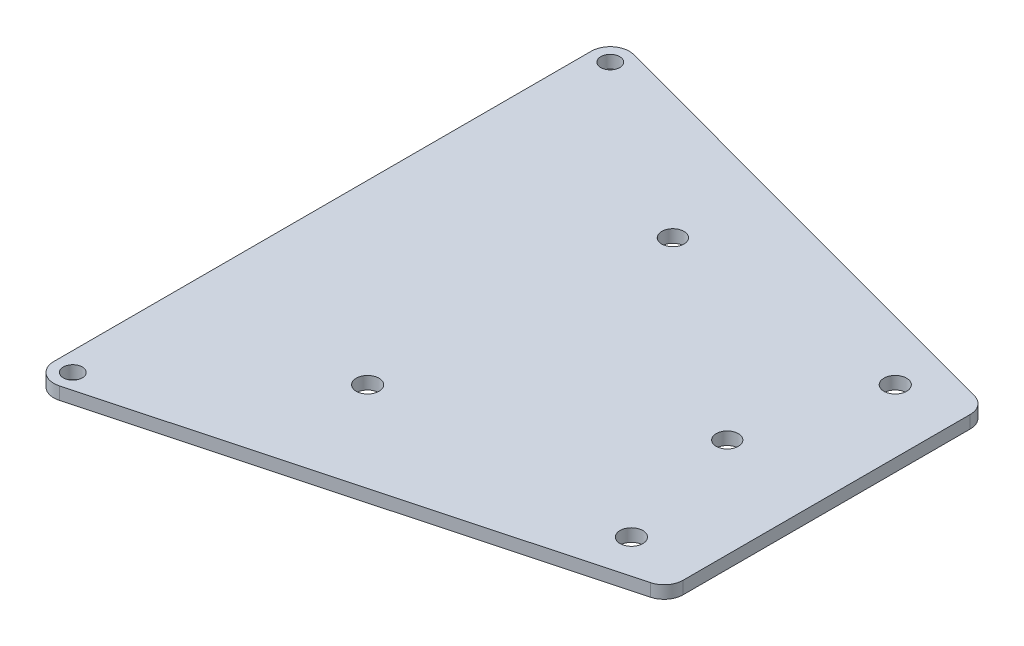
ISO-10303-21;
HEADER;
FILE_DESCRIPTION(('STEP AP214'),'2;1');
FILE_NAME('part.step','',(''),(''),'','','');
FILE_SCHEMA(('AUTOMOTIVE_DESIGN { 1 0 10303 214 1 1 1 1 }'));
ENDSEC;
DATA;
#1=APPLICATION_CONTEXT('core data for automotive mechanical design processes');
#2=APPLICATION_PROTOCOL_DEFINITION('international standard','automotive_design',2000,#1);
#3=PRODUCT_CONTEXT('',#1,'mechanical');
#4=PRODUCT('Part','Part','',(#3));
#5=PRODUCT_RELATED_PRODUCT_CATEGORY('part','',(#4));
#6=PRODUCT_DEFINITION_FORMATION('','',#4);
#7=PRODUCT_DEFINITION_CONTEXT('part definition',#1,'design');
#8=PRODUCT_DEFINITION('design','',#6,#7);
#9=PRODUCT_DEFINITION_SHAPE('','',#8);
#10=(LENGTH_UNIT() NAMED_UNIT(*) SI_UNIT(.MILLI.,.METRE.));
#11=(NAMED_UNIT(*) PLANE_ANGLE_UNIT() SI_UNIT($,.RADIAN.));
#12=(NAMED_UNIT(*) SI_UNIT($,.STERADIAN.) SOLID_ANGLE_UNIT());
#13=UNCERTAINTY_MEASURE_WITH_UNIT(LENGTH_MEASURE(1.E-05),#10,'distance_accuracy_value','');
#14=(GEOMETRIC_REPRESENTATION_CONTEXT(3) GLOBAL_UNCERTAINTY_ASSIGNED_CONTEXT((#13)) GLOBAL_UNIT_ASSIGNED_CONTEXT((#10,
#11,#12)) REPRESENTATION_CONTEXT('',''));
#15=CARTESIAN_POINT('',(0.,0.,0.));
#16=DIRECTION('',(0.,0.,1.));
#17=DIRECTION('',(1.,0.,0.));
#18=AXIS2_PLACEMENT_3D('',#15,#16,#17);
#19=CARTESIAN_POINT('',(73.72,2.,19.8005536758897));
#20=DIRECTION('',(0.,-1.,0.));
#21=DIRECTION('',(0.,0.,-1.));
#22=AXIS2_PLACEMENT_3D('',#19,#20,#21);
#23=CYLINDRICAL_SURFACE('',#22,3.);
#24=CARTESIAN_POINT('',(73.72,0.,19.8005536758897));
#25=DIRECTION('',(0.,1.,0.));
#26=DIRECTION('',(0.,0.,1.));
#27=AXIS2_PLACEMENT_3D('',#24,#25,#26);
#28=CIRCLE('',#27,3.);
#29=CARTESIAN_POINT('',(74.4981928710981,0.,16.9032418432814));
#30=VERTEX_POINT('',#29);
#31=CARTESIAN_POINT('',(76.72,0.,19.8005536758897));
#32=VERTEX_POINT('',#31);
#33=EDGE_CURVE('E160',#30,#32,#28,.F.);
#34=ORIENTED_EDGE('',*,*,#33,.F.);
#35=DIRECTION('',(0.,-1.,0.));
#36=VECTOR('',#35,1.);
#37=CARTESIAN_POINT('',(74.4981928710981,2.,16.9032418432814));
#38=LINE('',#37,#36);
#39=CARTESIAN_POINT('',(74.4981928710981,2.,16.9032418432814));
#40=VERTEX_POINT('',#39);
#41=EDGE_CURVE('E11',#40,#30,#38,.T.);
#42=ORIENTED_EDGE('',*,*,#41,.F.);
#43=CARTESIAN_POINT('',(73.72,2.,19.8005536758897));
#44=DIRECTION('',(0.,1.,0.));
#45=DIRECTION('',(0.,0.,1.));
#46=AXIS2_PLACEMENT_3D('',#43,#44,#45);
#47=CIRCLE('',#46,3.);
#48=CARTESIAN_POINT('',(76.72,2.,19.8005536758897));
#49=VERTEX_POINT('',#48);
#50=EDGE_CURVE('E218',#40,#49,#47,.F.);
#51=ORIENTED_EDGE('',*,*,#50,.T.);
#52=DIRECTION('',(0.,-1.,0.));
#53=VECTOR('',#52,1.);
#54=CARTESIAN_POINT('',(76.72,2.,19.8005536758897));
#55=LINE('',#54,#53);
#56=EDGE_CURVE('E59',#49,#32,#55,.T.);
#57=ORIENTED_EDGE('',*,*,#56,.T.);
#58=EDGE_LOOP('',(#34,#42,#51,#57));
#59=FACE_BOUND('',#58,.T.);
#60=ADVANCED_FACE('F41',(#59),#23,.T.);
#61=CARTESIAN_POINT('',(0.778192871098089,2.,-2.89731183260831));
#62=DIRECTION('',(0.259397623699363,0.,-0.965770610869436));
#63=DIRECTION('',(-0.965770610869436,0.,-0.259397623699363));
#64=AXIS2_PLACEMENT_3D('',#61,#62,#63);
#65=PLANE('',#64);
#66=DIRECTION('',(0.965770610869436,0.,0.259397623699363));
#67=VECTOR('',#66,1.);
#68=CARTESIAN_POINT('',(0.778192871098089,0.,-2.89731183260831));
#69=LINE('',#68,#67);
#70=CARTESIAN_POINT('',(0.778192871098089,0.,-2.89731183260831));
#71=VERTEX_POINT('',#70);
#72=EDGE_CURVE('E157',#71,#30,#69,.T.);
#73=ORIENTED_EDGE('',*,*,#72,.F.);
#74=DIRECTION('',(0.,-1.,0.));
#75=VECTOR('',#74,1.);
#76=CARTESIAN_POINT('',(0.778192871098089,2.,-2.89731183260831));
#77=LINE('',#76,#75);
#78=CARTESIAN_POINT('',(0.778192871098089,2.,-2.89731183260831));
#79=VERTEX_POINT('',#78);
#80=EDGE_CURVE('E49',#79,#71,#77,.T.);
#81=ORIENTED_EDGE('',*,*,#80,.F.);
#82=DIRECTION('',(0.965770610869436,0.,0.259397623699363));
#83=VECTOR('',#82,1.);
#84=CARTESIAN_POINT('',(0.778192871098089,2.,-2.89731183260831));
#85=LINE('',#84,#83);
#86=EDGE_CURVE('E216',#79,#40,#85,.T.);
#87=ORIENTED_EDGE('',*,*,#86,.T.);
#88=ORIENTED_EDGE('',*,*,#41,.T.);
#89=EDGE_LOOP('',(#73,#81,#87,#88));
#90=FACE_BOUND('',#89,.T.);
#91=ADVANCED_FACE('F206',(#90),#65,.T.);
#92=CARTESIAN_POINT('',(0.,2.,0.));
#93=DIRECTION('',(0.,-1.,0.));
#94=DIRECTION('',(0.,0.,-1.));
#95=AXIS2_PLACEMENT_3D('',#92,#93,#94);
#96=CYLINDRICAL_SURFACE('',#95,3.);
#97=CARTESIAN_POINT('',(0.,0.,0.));
#98=DIRECTION('',(0.,1.,0.));
#99=DIRECTION('',(0.,0.,1.));
#100=AXIS2_PLACEMENT_3D('',#97,#98,#99);
#101=CIRCLE('',#100,3.);
#102=CARTESIAN_POINT('',(-3.,0.,0.));
#103=VERTEX_POINT('',#102);
#104=EDGE_CURVE('E165',#103,#71,#101,.F.);
#105=ORIENTED_EDGE('',*,*,#104,.F.);
#106=DIRECTION('',(0.,-1.,0.));
#107=VECTOR('',#106,1.);
#108=CARTESIAN_POINT('',(-3.,2.,0.));
#109=LINE('',#108,#107);
#110=CARTESIAN_POINT('',(-3.,2.,0.));
#111=VERTEX_POINT('',#110);
#112=EDGE_CURVE('E191',#111,#103,#109,.T.);
#113=ORIENTED_EDGE('',*,*,#112,.F.);
#114=CARTESIAN_POINT('',(0.,2.,0.));
#115=DIRECTION('',(0.,1.,0.));
#116=DIRECTION('',(0.,0.,1.));
#117=AXIS2_PLACEMENT_3D('',#114,#115,#116);
#118=CIRCLE('',#117,3.);
#119=EDGE_CURVE('E205',#111,#79,#118,.F.);
#120=ORIENTED_EDGE('',*,*,#119,.T.);
#121=ORIENTED_EDGE('',*,*,#80,.T.);
#122=EDGE_LOOP('',(#105,#113,#120,#121));
#123=FACE_BOUND('',#122,.T.);
#124=ADVANCED_FACE('F199',(#123),#96,.T.);
#125=CARTESIAN_POINT('',(-3.,2.,0.));
#126=DIRECTION('',(-1.,0.,0.));
#127=DIRECTION('',(0.,0.,1.));
#128=AXIS2_PLACEMENT_3D('',#125,#126,#127);
#129=PLANE('',#128);
#130=DIRECTION('',(0.,0.,-1.));
#131=VECTOR('',#130,1.);
#132=CARTESIAN_POINT('',(-3.,0.,0.));
#133=LINE('',#132,#131);
#134=CARTESIAN_POINT('',(-3.,0.,85.));
#135=VERTEX_POINT('',#134);
#136=EDGE_CURVE('E164',#135,#103,#133,.T.);
#137=ORIENTED_EDGE('',*,*,#136,.F.);
#138=DIRECTION('',(0.,-1.,0.));
#139=VECTOR('',#138,1.);
#140=CARTESIAN_POINT('',(-3.,2.,85.));
#141=LINE('',#140,#139);
#142=CARTESIAN_POINT('',(-3.,2.,85.));
#143=VERTEX_POINT('',#142);
#144=EDGE_CURVE('E193',#143,#135,#141,.T.);
#145=ORIENTED_EDGE('',*,*,#144,.F.);
#146=DIRECTION('',(0.,0.,-1.));
#147=VECTOR('',#146,1.);
#148=CARTESIAN_POINT('',(-3.,2.,0.));
#149=LINE('',#148,#147);
#150=EDGE_CURVE('E214',#143,#111,#149,.T.);
#151=ORIENTED_EDGE('',*,*,#150,.T.);
#152=ORIENTED_EDGE('',*,*,#112,.T.);
#153=EDGE_LOOP('',(#137,#145,#151,#152));
#154=FACE_BOUND('',#153,.T.);
#155=ADVANCED_FACE('F213',(#154),#129,.T.);
#156=CARTESIAN_POINT('',(0.,2.,85.));
#157=DIRECTION('',(0.,-1.,0.));
#158=DIRECTION('',(0.,0.,-1.));
#159=AXIS2_PLACEMENT_3D('',#156,#157,#158);
#160=CYLINDRICAL_SURFACE('',#159,3.);
#161=CARTESIAN_POINT('',(0.,0.,85.));
#162=DIRECTION('',(0.,1.,0.));
#163=DIRECTION('',(0.,0.,1.));
#164=AXIS2_PLACEMENT_3D('',#161,#162,#163);
#165=CIRCLE('',#164,3.);
#166=CARTESIAN_POINT('',(0.778192871098087,0.,87.8973118326083));
#167=VERTEX_POINT('',#166);
#168=EDGE_CURVE('E169',#167,#135,#165,.F.);
#169=ORIENTED_EDGE('',*,*,#168,.F.);
#170=DIRECTION('',(0.,-1.,0.));
#171=VECTOR('',#170,1.);
#172=CARTESIAN_POINT('',(0.778192871098087,2.,87.8973118326083));
#173=LINE('',#172,#171);
#174=CARTESIAN_POINT('',(0.778192871098087,2.,87.8973118326083));
#175=VERTEX_POINT('',#174);
#176=EDGE_CURVE('E120',#175,#167,#173,.T.);
#177=ORIENTED_EDGE('',*,*,#176,.F.);
#178=CARTESIAN_POINT('',(0.,2.,85.));
#179=DIRECTION('',(0.,1.,0.));
#180=DIRECTION('',(0.,0.,1.));
#181=AXIS2_PLACEMENT_3D('',#178,#179,#180);
#182=CIRCLE('',#181,3.);
#183=EDGE_CURVE('E126',#175,#143,#182,.F.);
#184=ORIENTED_EDGE('',*,*,#183,.T.);
#185=ORIENTED_EDGE('',*,*,#144,.T.);
#186=EDGE_LOOP('',(#169,#177,#184,#185));
#187=FACE_BOUND('',#186,.T.);
#188=ADVANCED_FACE('F224',(#187),#160,.T.);
#189=CARTESIAN_POINT('',(22.0722739984463,2.,82.1779060222338));
#190=DIRECTION('',(0.259397623699363,0.,0.965770610869436));
#191=DIRECTION('',(0.965770610869436,0.,-0.259397623699363));
#192=AXIS2_PLACEMENT_3D('',#189,#190,#191);
#193=PLANE('',#192);
#194=DIRECTION('',(-0.965770610869436,0.,0.259397623699363));
#195=VECTOR('',#194,1.);
#196=CARTESIAN_POINT('',(22.0722739984463,0.,82.1779060222338));
#197=LINE('',#196,#195);
#198=CARTESIAN_POINT('',(74.4981928710981,0.,68.0967581567186));
#199=VERTEX_POINT('',#198);
#200=EDGE_CURVE('E114',#199,#167,#197,.T.);
#201=ORIENTED_EDGE('',*,*,#200,.F.);
#202=DIRECTION('',(0.,-1.,0.));
#203=VECTOR('',#202,1.);
#204=CARTESIAN_POINT('',(74.4981928710981,2.,68.0967581567186));
#205=LINE('',#204,#203);
#206=CARTESIAN_POINT('',(74.4981928710981,2.,68.0967581567186));
#207=VERTEX_POINT('',#206);
#208=EDGE_CURVE('E107',#207,#199,#205,.T.);
#209=ORIENTED_EDGE('',*,*,#208,.F.);
#210=DIRECTION('',(-0.965770610869436,0.,0.259397623699363));
#211=VECTOR('',#210,1.);
#212=CARTESIAN_POINT('',(22.0722739984463,2.,82.1779060222338));
#213=LINE('',#212,#211);
#214=EDGE_CURVE('E112',#207,#175,#213,.T.);
#215=ORIENTED_EDGE('',*,*,#214,.T.);
#216=ORIENTED_EDGE('',*,*,#176,.T.);
#217=EDGE_LOOP('',(#201,#209,#215,#216));
#218=FACE_BOUND('',#217,.T.);
#219=ADVANCED_FACE('F109',(#218),#193,.T.);
#220=CARTESIAN_POINT('',(73.72,2.,65.1994463241103));
#221=DIRECTION('',(0.,-1.,0.));
#222=DIRECTION('',(0.,0.,-1.));
#223=AXIS2_PLACEMENT_3D('',#220,#221,#222);
#224=CYLINDRICAL_SURFACE('',#223,3.00000000000001);
#225=CARTESIAN_POINT('',(73.72,0.,65.1994463241103));
#226=DIRECTION('',(0.,1.,0.));
#227=DIRECTION('',(0.,0.,1.));
#228=AXIS2_PLACEMENT_3D('',#225,#226,#227);
#229=CIRCLE('',#228,3.00000000000001);
#230=CARTESIAN_POINT('',(76.72,0.,65.1994463241103));
#231=VERTEX_POINT('',#230);
#232=EDGE_CURVE('E175',#231,#199,#229,.F.);
#233=ORIENTED_EDGE('',*,*,#232,.F.);
#234=DIRECTION('',(0.,-1.,0.));
#235=VECTOR('',#234,1.);
#236=CARTESIAN_POINT('',(76.72,2.,65.1994463241103));
#237=LINE('',#236,#235);
#238=CARTESIAN_POINT('',(76.72,2.,65.1994463241103));
#239=VERTEX_POINT('',#238);
#240=EDGE_CURVE('E83',#239,#231,#237,.T.);
#241=ORIENTED_EDGE('',*,*,#240,.F.);
#242=CARTESIAN_POINT('',(73.72,2.,65.1994463241103));
#243=DIRECTION('',(0.,1.,0.));
#244=DIRECTION('',(0.,0.,1.));
#245=AXIS2_PLACEMENT_3D('',#242,#243,#244);
#246=CIRCLE('',#245,3.00000000000001);
#247=EDGE_CURVE('E121',#239,#207,#246,.F.);
#248=ORIENTED_EDGE('',*,*,#247,.T.);
#249=ORIENTED_EDGE('',*,*,#208,.T.);
#250=EDGE_LOOP('',(#233,#241,#248,#249));
#251=FACE_BOUND('',#250,.T.);
#252=ADVANCED_FACE('F128',(#251),#224,.T.);
#253=CARTESIAN_POINT('',(66.72,2.,21.65));
#254=DIRECTION('',(0.,-1.,0.));
#255=DIRECTION('',(0.,0.,-1.));
#256=AXIS2_PLACEMENT_3D('',#253,#254,#255);
#257=CYLINDRICAL_SURFACE('',#256,1.79999999999999);
#258=CARTESIAN_POINT('',(66.72,2.,21.65));
#259=DIRECTION('',(0.,1.,0.));
#260=DIRECTION('',(0.,0.,1.));
#261=AXIS2_PLACEMENT_3D('',#258,#259,#260);
#262=CIRCLE('',#261,1.79999999999999);
#263=CARTESIAN_POINT('',(66.72,2.,23.45));
#264=VERTEX_POINT('',#263);
#265=EDGE_CURVE('E142',#264,#264,#262,.T.);
#266=ORIENTED_EDGE('',*,*,#265,.T.);
#267=EDGE_LOOP('',(#266));
#268=FACE_BOUND('',#267,.T.);
#269=CARTESIAN_POINT('',(66.72,0.,21.65));
#270=DIRECTION('',(0.,1.,0.));
#271=DIRECTION('',(0.,0.,1.));
#272=AXIS2_PLACEMENT_3D('',#269,#270,#271);
#273=CIRCLE('',#272,1.79999999999999);
#274=CARTESIAN_POINT('',(66.72,0.,23.45));
#275=VERTEX_POINT('',#274);
#276=EDGE_CURVE('E181',#275,#275,#273,.T.);
#277=ORIENTED_EDGE('',*,*,#276,.F.);
#278=EDGE_LOOP('',(#277));
#279=FACE_BOUND('',#278,.T.);
#280=ADVANCED_FACE('F274',(#268,#279),#257,.F.);
#281=CARTESIAN_POINT('',(66.72,2.,63.37));
#282=DIRECTION('',(0.,-1.,0.));
#283=DIRECTION('',(0.,0.,-1.));
#284=AXIS2_PLACEMENT_3D('',#281,#282,#283);
#285=CYLINDRICAL_SURFACE('',#284,1.79999999999998);
#286=CARTESIAN_POINT('',(66.72,2.,63.37));
#287=DIRECTION('',(0.,1.,0.));
#288=DIRECTION('',(0.,0.,1.));
#289=AXIS2_PLACEMENT_3D('',#286,#287,#288);
#290=CIRCLE('',#289,1.79999999999998);
#291=CARTESIAN_POINT('',(66.72,2.,65.17));
#292=VERTEX_POINT('',#291);
#293=EDGE_CURVE('E139',#292,#292,#290,.T.);
#294=ORIENTED_EDGE('',*,*,#293,.T.);
#295=EDGE_LOOP('',(#294));
#296=FACE_BOUND('',#295,.T.);
#297=CARTESIAN_POINT('',(66.72,0.,63.37));
#298=DIRECTION('',(0.,1.,0.));
#299=DIRECTION('',(0.,0.,1.));
#300=AXIS2_PLACEMENT_3D('',#297,#298,#299);
#301=CIRCLE('',#300,1.79999999999998);
#302=CARTESIAN_POINT('',(66.72,0.,65.17));
#303=VERTEX_POINT('',#302);
#304=EDGE_CURVE('E176',#303,#303,#301,.T.);
#305=ORIENTED_EDGE('',*,*,#304,.F.);
#306=EDGE_LOOP('',(#305));
#307=FACE_BOUND('',#306,.T.);
#308=ADVANCED_FACE('F237',(#296,#307),#285,.F.);
#309=CARTESIAN_POINT('',(0.,2.,0.));
#310=DIRECTION('',(0.,-1.,0.));
#311=DIRECTION('',(0.,0.,-1.));
#312=AXIS2_PLACEMENT_3D('',#309,#310,#311);
#313=CYLINDRICAL_SURFACE('',#312,1.5);
#314=CARTESIAN_POINT('',(0.,2.,0.));
#315=DIRECTION('',(0.,1.,0.));
#316=DIRECTION('',(0.,0.,1.));
#317=AXIS2_PLACEMENT_3D('',#314,#315,#316);
#318=CIRCLE('',#317,1.5);
#319=CARTESIAN_POINT('',(0.,2.,1.5));
#320=VERTEX_POINT('',#319);
#321=EDGE_CURVE('E134',#320,#320,#318,.T.);
#322=ORIENTED_EDGE('',*,*,#321,.T.);
#323=EDGE_LOOP('',(#322));
#324=FACE_BOUND('',#323,.T.);
#325=CARTESIAN_POINT('',(0.,0.,0.));
#326=DIRECTION('',(0.,1.,0.));
#327=DIRECTION('',(0.,0.,1.));
#328=AXIS2_PLACEMENT_3D('',#325,#326,#327);
#329=CIRCLE('',#328,1.5);
#330=CARTESIAN_POINT('',(0.,0.,1.5));
#331=VERTEX_POINT('',#330);
#332=EDGE_CURVE('E180',#331,#331,#329,.T.);
#333=ORIENTED_EDGE('',*,*,#332,.F.);
#334=EDGE_LOOP('',(#333));
#335=FACE_BOUND('',#334,.T.);
#336=ADVANCED_FACE('F230',(#324,#335),#313,.F.);
#337=CARTESIAN_POINT('',(76.72,2.,0.));
#338=DIRECTION('',(1.,0.,0.));
#339=DIRECTION('',(0.,0.,-1.));
#340=AXIS2_PLACEMENT_3D('',#337,#338,#339);
#341=PLANE('',#340);
#342=DIRECTION('',(0.,0.,1.));
#343=VECTOR('',#342,1.);
#344=CARTESIAN_POINT('',(76.72,0.,0.));
#345=LINE('',#344,#343);
#346=EDGE_CURVE('E171',#32,#231,#345,.T.);
#347=ORIENTED_EDGE('',*,*,#346,.F.);
#348=ORIENTED_EDGE('',*,*,#56,.F.);
#349=DIRECTION('',(0.,0.,1.));
#350=VECTOR('',#349,1.);
#351=CARTESIAN_POINT('',(76.72,2.,0.));
#352=LINE('',#351,#350);
#353=EDGE_CURVE('E132',#49,#239,#352,.T.);
#354=ORIENTED_EDGE('',*,*,#353,.T.);
#355=ORIENTED_EDGE('',*,*,#240,.T.);
#356=EDGE_LOOP('',(#347,#348,#354,#355));
#357=FACE_BOUND('',#356,.T.);
#358=ADVANCED_FACE('F221',(#357),#341,.T.);
#359=CARTESIAN_POINT('',(29.,2.,19.1));
#360=DIRECTION('',(0.,-1.,0.));
#361=DIRECTION('',(0.,0.,-1.));
#362=AXIS2_PLACEMENT_3D('',#359,#360,#361);
#363=CYLINDRICAL_SURFACE('',#362,1.75);
#364=CARTESIAN_POINT('',(29.,2.,19.1));
#365=DIRECTION('',(0.,1.,0.));
#366=DIRECTION('',(0.,0.,1.));
#367=AXIS2_PLACEMENT_3D('',#364,#365,#366);
#368=CIRCLE('',#367,1.75);
#369=CARTESIAN_POINT('',(29.,2.,20.85));
#370=VERTEX_POINT('',#369);
#371=EDGE_CURVE('E407',#370,#370,#368,.T.);
#372=ORIENTED_EDGE('',*,*,#371,.T.);
#373=EDGE_LOOP('',(#372));
#374=FACE_BOUND('',#373,.T.);
#375=CARTESIAN_POINT('',(29.,0.,19.1));
#376=DIRECTION('',(0.,1.,0.));
#377=DIRECTION('',(0.,0.,1.));
#378=AXIS2_PLACEMENT_3D('',#375,#376,#377);
#379=CIRCLE('',#378,1.75);
#380=CARTESIAN_POINT('',(29.,0.,20.85));
#381=VERTEX_POINT('',#380);
#382=EDGE_CURVE('E152',#381,#381,#379,.T.);
#383=ORIENTED_EDGE('',*,*,#382,.F.);
#384=EDGE_LOOP('',(#383));
#385=FACE_BOUND('',#384,.T.);
#386=ADVANCED_FACE('F227',(#374,#385),#363,.F.);
#387=CARTESIAN_POINT('',(61.,2.,42.5));
#388=DIRECTION('',(0.,-1.,0.));
#389=DIRECTION('',(0.,0.,-1.));
#390=AXIS2_PLACEMENT_3D('',#387,#388,#389);
#391=CYLINDRICAL_SURFACE('',#390,1.75);
#392=CARTESIAN_POINT('',(61.,2.,42.5));
#393=DIRECTION('',(0.,1.,0.));
#394=DIRECTION('',(0.,0.,1.));
#395=AXIS2_PLACEMENT_3D('',#392,#393,#394);
#396=CIRCLE('',#395,1.75);
#397=CARTESIAN_POINT('',(61.,2.,44.25));
#398=VERTEX_POINT('',#397);
#399=EDGE_CURVE('E260',#398,#398,#396,.T.);
#400=ORIENTED_EDGE('',*,*,#399,.T.);
#401=EDGE_LOOP('',(#400));
#402=FACE_BOUND('',#401,.T.);
#403=CARTESIAN_POINT('',(61.,0.,42.5));
#404=DIRECTION('',(0.,1.,0.));
#405=DIRECTION('',(0.,0.,1.));
#406=AXIS2_PLACEMENT_3D('',#403,#404,#405);
#407=CIRCLE('',#406,1.75);
#408=CARTESIAN_POINT('',(61.,0.,44.25));
#409=VERTEX_POINT('',#408);
#410=EDGE_CURVE('E151',#409,#409,#407,.T.);
#411=ORIENTED_EDGE('',*,*,#410,.F.);
#412=EDGE_LOOP('',(#411));
#413=FACE_BOUND('',#412,.T.);
#414=ADVANCED_FACE('F233',(#402,#413),#391,.F.);
#415=CARTESIAN_POINT('',(0.,2.,85.));
#416=DIRECTION('',(0.,-1.,0.));
#417=DIRECTION('',(0.,0.,-1.));
#418=AXIS2_PLACEMENT_3D('',#415,#416,#417);
#419=CYLINDRICAL_SURFACE('',#418,1.5);
#420=CARTESIAN_POINT('',(0.,2.,85.));
#421=DIRECTION('',(0.,1.,0.));
#422=DIRECTION('',(0.,0.,1.));
#423=AXIS2_PLACEMENT_3D('',#420,#421,#422);
#424=CIRCLE('',#423,1.5);
#425=CARTESIAN_POINT('',(0.,2.,86.5));
#426=VERTEX_POINT('',#425);
#427=EDGE_CURVE('E186',#426,#426,#424,.T.);
#428=ORIENTED_EDGE('',*,*,#427,.T.);
#429=EDGE_LOOP('',(#428));
#430=FACE_BOUND('',#429,.T.);
#431=CARTESIAN_POINT('',(0.,0.,85.));
#432=DIRECTION('',(0.,1.,0.));
#433=DIRECTION('',(0.,0.,1.));
#434=AXIS2_PLACEMENT_3D('',#431,#432,#433);
#435=CIRCLE('',#434,1.5);
#436=CARTESIAN_POINT('',(0.,0.,86.5));
#437=VERTEX_POINT('',#436);
#438=EDGE_CURVE('E146',#437,#437,#435,.T.);
#439=ORIENTED_EDGE('',*,*,#438,.F.);
#440=EDGE_LOOP('',(#439));
#441=FACE_BOUND('',#440,.T.);
#442=ADVANCED_FACE('F43',(#430,#441),#419,.F.);
#443=CARTESIAN_POINT('',(25.,2.,63.37));
#444=DIRECTION('',(0.,-1.,0.));
#445=DIRECTION('',(0.,0.,-1.));
#446=AXIS2_PLACEMENT_3D('',#443,#444,#445);
#447=CYLINDRICAL_SURFACE('',#446,1.8);
#448=CARTESIAN_POINT('',(25.,2.,63.37));
#449=DIRECTION('',(0.,1.,0.));
#450=DIRECTION('',(0.,0.,1.));
#451=AXIS2_PLACEMENT_3D('',#448,#449,#450);
#452=CIRCLE('',#451,1.8);
#453=CARTESIAN_POINT('',(25.,2.,65.17));
#454=VERTEX_POINT('',#453);
#455=EDGE_CURVE('E144',#454,#454,#452,.T.);
#456=ORIENTED_EDGE('',*,*,#455,.T.);
#457=EDGE_LOOP('',(#456));
#458=FACE_BOUND('',#457,.T.);
#459=CARTESIAN_POINT('',(25.,0.,63.37));
#460=DIRECTION('',(0.,1.,0.));
#461=DIRECTION('',(0.,0.,1.));
#462=AXIS2_PLACEMENT_3D('',#459,#460,#461);
#463=CIRCLE('',#462,1.8);
#464=CARTESIAN_POINT('',(25.,0.,65.17));
#465=VERTEX_POINT('',#464);
#466=EDGE_CURVE('E187',#465,#465,#463,.T.);
#467=ORIENTED_EDGE('',*,*,#466,.F.);
#468=EDGE_LOOP('',(#467));
#469=FACE_BOUND('',#468,.T.);
#470=ADVANCED_FACE('F252',(#458,#469),#447,.F.);
#471=CARTESIAN_POINT('',(0.,2.,0.));
#472=DIRECTION('',(0.,1.,0.));
#473=DIRECTION('',(0.,0.,1.));
#474=AXIS2_PLACEMENT_3D('',#471,#472,#473);
#475=PLANE('',#474);
#476=ORIENTED_EDGE('',*,*,#427,.F.);
#477=EDGE_LOOP('',(#476));
#478=FACE_BOUND('',#477,.T.);
#479=ORIENTED_EDGE('',*,*,#399,.F.);
#480=EDGE_LOOP('',(#479));
#481=FACE_BOUND('',#480,.T.);
#482=ORIENTED_EDGE('',*,*,#371,.F.);
#483=EDGE_LOOP('',(#482));
#484=FACE_BOUND('',#483,.T.);
#485=ORIENTED_EDGE('',*,*,#50,.F.);
#486=ORIENTED_EDGE('',*,*,#86,.F.);
#487=ORIENTED_EDGE('',*,*,#119,.F.);
#488=ORIENTED_EDGE('',*,*,#150,.F.);
#489=ORIENTED_EDGE('',*,*,#183,.F.);
#490=ORIENTED_EDGE('',*,*,#214,.F.);
#491=ORIENTED_EDGE('',*,*,#247,.F.);
#492=ORIENTED_EDGE('',*,*,#353,.F.);
#493=EDGE_LOOP('',(#485,#486,#487,#488,#489,#490,#491,#492));
#494=FACE_BOUND('',#493,.T.);
#495=ORIENTED_EDGE('',*,*,#321,.F.);
#496=EDGE_LOOP('',(#495));
#497=FACE_BOUND('',#496,.T.);
#498=ORIENTED_EDGE('',*,*,#293,.F.);
#499=EDGE_LOOP('',(#498));
#500=FACE_BOUND('',#499,.T.);
#501=ORIENTED_EDGE('',*,*,#265,.F.);
#502=EDGE_LOOP('',(#501));
#503=FACE_BOUND('',#502,.T.);
#504=ORIENTED_EDGE('',*,*,#455,.F.);
#505=EDGE_LOOP('',(#504));
#506=FACE_BOUND('',#505,.T.);
#507=ADVANCED_FACE('F125',(#478,#481,#484,#494,#497,#500,#503,#506),#475,.T.);
#508=CARTESIAN_POINT('',(0.,0.,0.));
#509=DIRECTION('',(0.,1.,0.));
#510=DIRECTION('',(0.,0.,1.));
#511=AXIS2_PLACEMENT_3D('',#508,#509,#510);
#512=PLANE('',#511);
#513=ORIENTED_EDGE('',*,*,#438,.T.);
#514=EDGE_LOOP('',(#513));
#515=FACE_BOUND('',#514,.T.);
#516=ORIENTED_EDGE('',*,*,#410,.T.);
#517=EDGE_LOOP('',(#516));
#518=FACE_BOUND('',#517,.T.);
#519=ORIENTED_EDGE('',*,*,#382,.T.);
#520=EDGE_LOOP('',(#519));
#521=FACE_BOUND('',#520,.T.);
#522=ORIENTED_EDGE('',*,*,#33,.T.);
#523=ORIENTED_EDGE('',*,*,#346,.T.);
#524=ORIENTED_EDGE('',*,*,#232,.T.);
#525=ORIENTED_EDGE('',*,*,#200,.T.);
#526=ORIENTED_EDGE('',*,*,#168,.T.);
#527=ORIENTED_EDGE('',*,*,#136,.T.);
#528=ORIENTED_EDGE('',*,*,#104,.T.);
#529=ORIENTED_EDGE('',*,*,#72,.T.);
#530=EDGE_LOOP('',(#522,#523,#524,#525,#526,#527,#528,#529));
#531=FACE_BOUND('',#530,.T.);
#532=ORIENTED_EDGE('',*,*,#332,.T.);
#533=EDGE_LOOP('',(#532));
#534=FACE_BOUND('',#533,.T.);
#535=ORIENTED_EDGE('',*,*,#304,.T.);
#536=EDGE_LOOP('',(#535));
#537=FACE_BOUND('',#536,.T.);
#538=ORIENTED_EDGE('',*,*,#276,.T.);
#539=EDGE_LOOP('',(#538));
#540=FACE_BOUND('',#539,.T.);
#541=ORIENTED_EDGE('',*,*,#466,.T.);
#542=EDGE_LOOP('',(#541));
#543=FACE_BOUND('',#542,.T.);
#544=ADVANCED_FACE('F208',(#515,#518,#521,#531,#534,#537,#540,#543),#512,.F.);
#545=CLOSED_SHELL('',(#60,#91,#124,#155,#188,#219,#252,#280,#308,#336,#358,#386,#414,#442,#470,
#507,#544));
#546=MANIFOLD_SOLID_BREP('B2',#545);
#547=ADVANCED_BREP_SHAPE_REPRESENTATION('',(#18,#546),#14);
#548=SHAPE_DEFINITION_REPRESENTATION(#9,#547);
ENDSEC;
END-ISO-10303-21;
